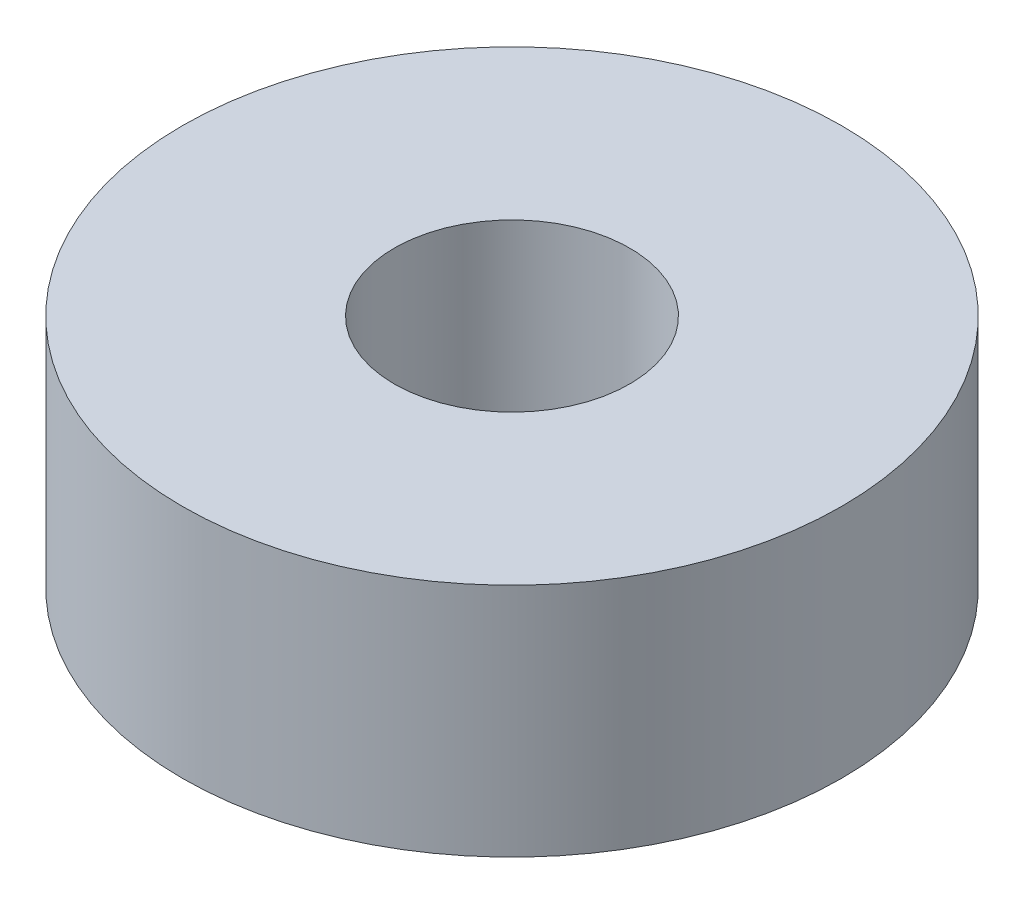
ISO-10303-21;
HEADER;
FILE_DESCRIPTION(('STEP AP214'),'2;1');
FILE_NAME('part.step','',(''),(''),'','','');
FILE_SCHEMA(('AUTOMOTIVE_DESIGN { 1 0 10303 214 1 1 1 1 }'));
ENDSEC;
DATA;
#1=APPLICATION_CONTEXT('core data for automotive mechanical design processes');
#2=APPLICATION_PROTOCOL_DEFINITION('international standard','automotive_design',2000,#1);
#3=PRODUCT_CONTEXT('',#1,'mechanical');
#4=PRODUCT('Part','Part','',(#3));
#5=PRODUCT_RELATED_PRODUCT_CATEGORY('part','',(#4));
#6=PRODUCT_DEFINITION_FORMATION('','',#4);
#7=PRODUCT_DEFINITION_CONTEXT('part definition',#1,'design');
#8=PRODUCT_DEFINITION('design','',#6,#7);
#9=PRODUCT_DEFINITION_SHAPE('','',#8);
#10=(LENGTH_UNIT() NAMED_UNIT(*) SI_UNIT(.MILLI.,.METRE.));
#11=(NAMED_UNIT(*) PLANE_ANGLE_UNIT() SI_UNIT($,.RADIAN.));
#12=(NAMED_UNIT(*) SI_UNIT($,.STERADIAN.) SOLID_ANGLE_UNIT());
#13=UNCERTAINTY_MEASURE_WITH_UNIT(LENGTH_MEASURE(1.E-05),#10,'distance_accuracy_value','');
#14=(GEOMETRIC_REPRESENTATION_CONTEXT(3) GLOBAL_UNCERTAINTY_ASSIGNED_CONTEXT((#13)) GLOBAL_UNIT_ASSIGNED_CONTEXT((#10,
#11,#12)) REPRESENTATION_CONTEXT('',''));
#15=CARTESIAN_POINT('',(0.,0.,0.));
#16=DIRECTION('',(0.,0.,1.));
#17=DIRECTION('',(1.,0.,0.));
#18=AXIS2_PLACEMENT_3D('',#15,#16,#17);
#19=CARTESIAN_POINT('',(0.,5.,0.));
#20=DIRECTION('',(0.,1.,0.));
#21=DIRECTION('',(0.,0.,1.));
#22=AXIS2_PLACEMENT_3D('',#19,#20,#21);
#23=PLANE('',#22);
#24=CARTESIAN_POINT('',(0.,5.,0.));
#25=DIRECTION('',(0.,1.,0.));
#26=DIRECTION('',(0.,0.,1.));
#27=AXIS2_PLACEMENT_3D('',#24,#25,#26);
#28=CIRCLE('',#27,7.);
#29=CARTESIAN_POINT('',(0.,5.,7.));
#30=VERTEX_POINT('',#29);
#31=EDGE_CURVE('E10',#30,#30,#28,.T.);
#32=ORIENTED_EDGE('',*,*,#31,.T.);
#33=EDGE_LOOP('',(#32));
#34=FACE_BOUND('',#33,.T.);
#35=CARTESIAN_POINT('',(0.,5.,0.));
#36=DIRECTION('',(0.,1.,0.));
#37=DIRECTION('',(0.,0.,1.));
#38=AXIS2_PLACEMENT_3D('',#35,#36,#37);
#39=CIRCLE('',#38,2.5);
#40=CARTESIAN_POINT('',(0.,5.,2.5));
#41=VERTEX_POINT('',#40);
#42=EDGE_CURVE('E54',#41,#41,#39,.T.);
#43=ORIENTED_EDGE('',*,*,#42,.F.);
#44=EDGE_LOOP('',(#43));
#45=FACE_BOUND('',#44,.T.);
#46=ADVANCED_FACE('F41',(#34,#45),#23,.T.);
#47=CARTESIAN_POINT('',(0.,0.,0.));
#48=DIRECTION('',(0.,1.,0.));
#49=DIRECTION('',(0.,0.,1.));
#50=AXIS2_PLACEMENT_3D('',#47,#48,#49);
#51=PLANE('',#50);
#52=CARTESIAN_POINT('',(0.,0.,0.));
#53=DIRECTION('',(0.,1.,0.));
#54=DIRECTION('',(0.,0.,1.));
#55=AXIS2_PLACEMENT_3D('',#52,#53,#54);
#56=CIRCLE('',#55,7.);
#57=CARTESIAN_POINT('',(0.,0.,7.));
#58=VERTEX_POINT('',#57);
#59=EDGE_CURVE('E45',#58,#58,#56,.T.);
#60=ORIENTED_EDGE('',*,*,#59,.F.);
#61=EDGE_LOOP('',(#60));
#62=FACE_BOUND('',#61,.T.);
#63=CARTESIAN_POINT('',(0.,0.,0.));
#64=DIRECTION('',(0.,1.,0.));
#65=DIRECTION('',(0.,0.,1.));
#66=AXIS2_PLACEMENT_3D('',#63,#64,#65);
#67=CIRCLE('',#66,2.5);
#68=CARTESIAN_POINT('',(0.,0.,2.5));
#69=VERTEX_POINT('',#68);
#70=EDGE_CURVE('E56',#69,#69,#67,.T.);
#71=ORIENTED_EDGE('',*,*,#70,.T.);
#72=EDGE_LOOP('',(#71));
#73=FACE_BOUND('',#72,.T.);
#74=ADVANCED_FACE('F68',(#62,#73),#51,.F.);
#75=CARTESIAN_POINT('',(0.,5.,0.));
#76=DIRECTION('',(0.,-1.,0.));
#77=DIRECTION('',(0.,0.,-1.));
#78=AXIS2_PLACEMENT_3D('',#75,#76,#77);
#79=CYLINDRICAL_SURFACE('',#78,7.);
#80=ORIENTED_EDGE('',*,*,#31,.F.);
#81=EDGE_LOOP('',(#80));
#82=FACE_BOUND('',#81,.T.);
#83=ORIENTED_EDGE('',*,*,#59,.T.);
#84=EDGE_LOOP('',(#83));
#85=FACE_BOUND('',#84,.T.);
#86=ADVANCED_FACE('F43',(#82,#85),#79,.T.);
#87=CARTESIAN_POINT('',(0.,5.,0.));
#88=DIRECTION('',(0.,-1.,0.));
#89=DIRECTION('',(0.,0.,-1.));
#90=AXIS2_PLACEMENT_3D('',#87,#88,#89);
#91=CYLINDRICAL_SURFACE('',#90,2.5);
#92=ORIENTED_EDGE('',*,*,#42,.T.);
#93=EDGE_LOOP('',(#92));
#94=FACE_BOUND('',#93,.T.);
#95=ORIENTED_EDGE('',*,*,#70,.F.);
#96=EDGE_LOOP('',(#95));
#97=FACE_BOUND('',#96,.T.);
#98=ADVANCED_FACE('F64',(#94,#97),#91,.F.);
#99=CLOSED_SHELL('',(#46,#74,#86,#98));
#100=MANIFOLD_SOLID_BREP('B2',#99);
#101=ADVANCED_BREP_SHAPE_REPRESENTATION('',(#18,#100),#14);
#102=SHAPE_DEFINITION_REPRESENTATION(#9,#101);
ENDSEC;
END-ISO-10303-21;
